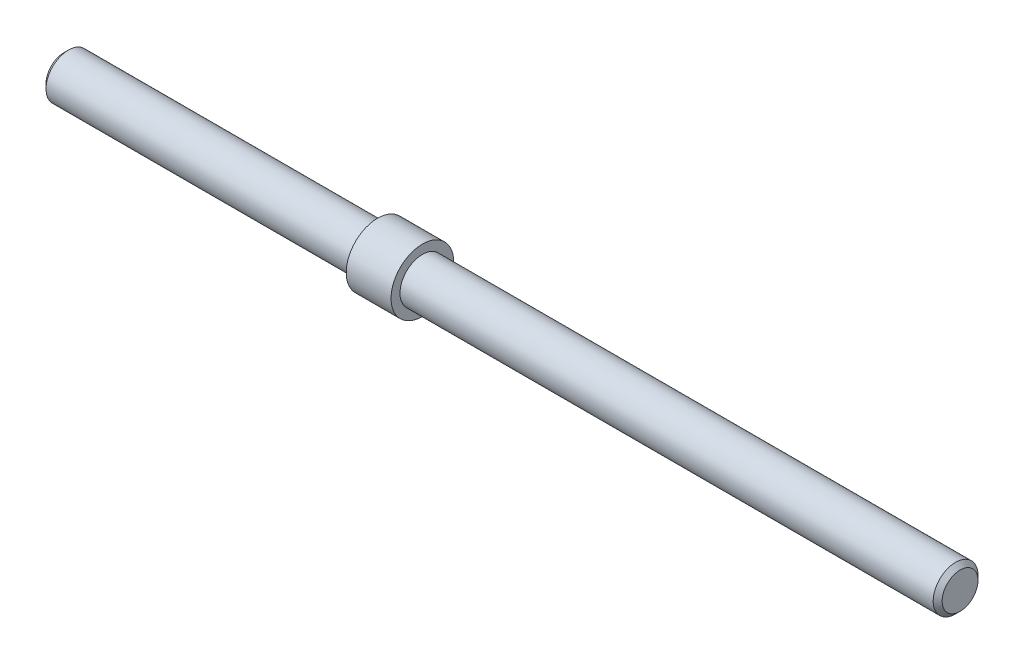
ISO-10303-21;
HEADER;
FILE_DESCRIPTION(('STEP AP214'),'2;1');
FILE_NAME('part.step','',(''),(''),'','','');
FILE_SCHEMA(('AUTOMOTIVE_DESIGN { 1 0 10303 214 1 1 1 1 }'));
ENDSEC;
DATA;
#1=APPLICATION_CONTEXT('core data for automotive mechanical design processes');
#2=APPLICATION_PROTOCOL_DEFINITION('international standard','automotive_design',2000,#1);
#3=PRODUCT_CONTEXT('',#1,'mechanical');
#4=PRODUCT('Part','Part','',(#3));
#5=PRODUCT_RELATED_PRODUCT_CATEGORY('part','',(#4));
#6=PRODUCT_DEFINITION_FORMATION('','',#4);
#7=PRODUCT_DEFINITION_CONTEXT('part definition',#1,'design');
#8=PRODUCT_DEFINITION('design','',#6,#7);
#9=PRODUCT_DEFINITION_SHAPE('','',#8);
#10=(LENGTH_UNIT() NAMED_UNIT(*) SI_UNIT(.MILLI.,.METRE.));
#11=(NAMED_UNIT(*) PLANE_ANGLE_UNIT() SI_UNIT($,.RADIAN.));
#12=(NAMED_UNIT(*) SI_UNIT($,.STERADIAN.) SOLID_ANGLE_UNIT());
#13=UNCERTAINTY_MEASURE_WITH_UNIT(LENGTH_MEASURE(1.E-05),#10,'distance_accuracy_value','');
#14=(GEOMETRIC_REPRESENTATION_CONTEXT(3) GLOBAL_UNCERTAINTY_ASSIGNED_CONTEXT((#13)) GLOBAL_UNIT_ASSIGNED_CONTEXT((#10,
#11,#12)) REPRESENTATION_CONTEXT('',''));
#15=CARTESIAN_POINT('',(0.,0.,0.));
#16=DIRECTION('',(0.,0.,1.));
#17=DIRECTION('',(1.,0.,0.));
#18=AXIS2_PLACEMENT_3D('',#15,#16,#17);
#19=CARTESIAN_POINT('',(200.,0.,0.));
#20=DIRECTION('',(-1.,0.,0.));
#21=DIRECTION('',(0.,0.,1.));
#22=AXIS2_PLACEMENT_3D('',#19,#20,#21);
#23=CYLINDRICAL_SURFACE('',#22,5.);
#24=CARTESIAN_POINT('',(80.,0.,0.));
#25=DIRECTION('',(1.,0.,0.));
#26=DIRECTION('',(0.,0.,-1.));
#27=AXIS2_PLACEMENT_3D('',#24,#25,#26);
#28=CIRCLE('',#27,5.);
#29=CARTESIAN_POINT('',(80.,0.,-5.));
#30=VERTEX_POINT('',#29);
#31=EDGE_CURVE('E48',#30,#30,#28,.T.);
#32=ORIENTED_EDGE('',*,*,#31,.T.);
#33=EDGE_LOOP('',(#32));
#34=FACE_BOUND('',#33,.T.);
#35=CARTESIAN_POINT('',(199.,0.,0.));
#36=DIRECTION('',(1.,0.,0.));
#37=DIRECTION('',(0.,0.,-1.));
#38=AXIS2_PLACEMENT_3D('',#35,#36,#37);
#39=CIRCLE('',#38,5.);
#40=CARTESIAN_POINT('',(199.,0.,-5.));
#41=VERTEX_POINT('',#40);
#42=EDGE_CURVE('E58',#41,#41,#39,.F.);
#43=ORIENTED_EDGE('',*,*,#42,.T.);
#44=EDGE_LOOP('',(#43));
#45=FACE_BOUND('',#44,.T.);
#46=ADVANCED_FACE('F43',(#34,#45),#23,.T.);
#47=CARTESIAN_POINT('',(200.,0.,0.));
#48=DIRECTION('',(1.,0.,0.));
#49=DIRECTION('',(0.,0.,-1.));
#50=AXIS2_PLACEMENT_3D('',#47,#48,#49);
#51=PLANE('',#50);
#52=CARTESIAN_POINT('',(200.,0.,0.));
#53=DIRECTION('',(1.,0.,0.));
#54=DIRECTION('',(0.,0.,-1.));
#55=AXIS2_PLACEMENT_3D('',#52,#53,#54);
#56=CIRCLE('',#55,4.);
#57=CARTESIAN_POINT('',(200.,0.,-4.));
#58=VERTEX_POINT('',#57);
#59=EDGE_CURVE('E68',#58,#58,#56,.T.);
#60=ORIENTED_EDGE('',*,*,#59,.T.);
#61=EDGE_LOOP('',(#60));
#62=FACE_BOUND('',#61,.T.);
#63=ADVANCED_FACE('F102',(#62),#51,.T.);
#64=CARTESIAN_POINT('',(200.,0.,0.));
#65=DIRECTION('',(-1.,0.,0.));
#66=DIRECTION('',(0.,0.,1.));
#67=AXIS2_PLACEMENT_3D('',#64,#65,#66);
#68=CONICAL_SURFACE('',#67,4.,0.78539816339746);
#69=ORIENTED_EDGE('',*,*,#42,.F.);
#70=EDGE_LOOP('',(#69));
#71=FACE_BOUND('',#70,.T.);
#72=ORIENTED_EDGE('',*,*,#59,.F.);
#73=EDGE_LOOP('',(#72));
#74=FACE_BOUND('',#73,.T.);
#75=ADVANCED_FACE('F98',(#71,#74),#68,.T.);
#76=CARTESIAN_POINT('',(80.,0.,0.));
#77=DIRECTION('',(-1.,0.,0.));
#78=DIRECTION('',(0.,0.,1.));
#79=AXIS2_PLACEMENT_3D('',#76,#77,#78);
#80=CYLINDRICAL_SURFACE('',#79,7.);
#81=CARTESIAN_POINT('',(80.,0.,0.));
#82=DIRECTION('',(1.,0.,0.));
#83=DIRECTION('',(0.,0.,-1.));
#84=AXIS2_PLACEMENT_3D('',#81,#82,#83);
#85=CIRCLE('',#84,7.);
#86=CARTESIAN_POINT('',(80.,0.,-7.));
#87=VERTEX_POINT('',#86);
#88=EDGE_CURVE('E76',#87,#87,#85,.T.);
#89=ORIENTED_EDGE('',*,*,#88,.F.);
#90=EDGE_LOOP('',(#89));
#91=FACE_BOUND('',#90,.T.);
#92=CARTESIAN_POINT('',(70.,0.,0.));
#93=DIRECTION('',(1.,0.,0.));
#94=DIRECTION('',(0.,0.,-1.));
#95=AXIS2_PLACEMENT_3D('',#92,#93,#94);
#96=CIRCLE('',#95,7.);
#97=CARTESIAN_POINT('',(70.,0.,-7.));
#98=VERTEX_POINT('',#97);
#99=EDGE_CURVE('E72',#98,#98,#96,.T.);
#100=ORIENTED_EDGE('',*,*,#99,.T.);
#101=EDGE_LOOP('',(#100));
#102=FACE_BOUND('',#101,.T.);
#103=ADVANCED_FACE('F90',(#91,#102),#80,.T.);
#104=CARTESIAN_POINT('',(80.,0.,0.));
#105=DIRECTION('',(1.,0.,0.));
#106=DIRECTION('',(0.,0.,-1.));
#107=AXIS2_PLACEMENT_3D('',#104,#105,#106);
#108=PLANE('',#107);
#109=ORIENTED_EDGE('',*,*,#31,.F.);
#110=EDGE_LOOP('',(#109));
#111=FACE_BOUND('',#110,.T.);
#112=ORIENTED_EDGE('',*,*,#88,.T.);
#113=EDGE_LOOP('',(#112));
#114=FACE_BOUND('',#113,.T.);
#115=ADVANCED_FACE('F87',(#111,#114),#108,.T.);
#116=CARTESIAN_POINT('',(70.,0.,0.));
#117=DIRECTION('',(1.,0.,0.));
#118=DIRECTION('',(0.,0.,-1.));
#119=AXIS2_PLACEMENT_3D('',#116,#117,#118);
#120=PLANE('',#119);
#121=CARTESIAN_POINT('',(70.,0.,0.));
#122=DIRECTION('',(1.,0.,0.));
#123=DIRECTION('',(0.,0.,-1.));
#124=AXIS2_PLACEMENT_3D('',#121,#122,#123);
#125=CIRCLE('',#124,5.);
#126=CARTESIAN_POINT('',(70.,0.,-5.));
#127=VERTEX_POINT('',#126);
#128=EDGE_CURVE('E10',#127,#127,#125,.T.);
#129=ORIENTED_EDGE('',*,*,#128,.T.);
#130=EDGE_LOOP('',(#129));
#131=FACE_BOUND('',#130,.T.);
#132=ORIENTED_EDGE('',*,*,#99,.F.);
#133=EDGE_LOOP('',(#132));
#134=FACE_BOUND('',#133,.T.);
#135=ADVANCED_FACE('F89',(#131,#134),#120,.F.);
#136=CARTESIAN_POINT('',(0.,0.,0.));
#137=DIRECTION('',(1.,0.,0.));
#138=DIRECTION('',(0.,0.,-1.));
#139=AXIS2_PLACEMENT_3D('',#136,#137,#138);
#140=PLANE('',#139);
#141=CARTESIAN_POINT('',(0.,0.,0.));
#142=DIRECTION('',(1.,0.,0.));
#143=DIRECTION('',(0.,0.,-1.));
#144=AXIS2_PLACEMENT_3D('',#141,#142,#143);
#145=CIRCLE('',#144,4.00000000000003);
#146=CARTESIAN_POINT('',(0.,0.,-4.00000000000003));
#147=VERTEX_POINT('',#146);
#148=EDGE_CURVE('E53',#147,#147,#145,.F.);
#149=ORIENTED_EDGE('',*,*,#148,.T.);
#150=EDGE_LOOP('',(#149));
#151=FACE_BOUND('',#150,.T.);
#152=ADVANCED_FACE('F96',(#151),#140,.F.);
#153=CARTESIAN_POINT('',(0.999999999999945,0.,0.));
#154=DIRECTION('',(1.,0.,0.));
#155=DIRECTION('',(0.,0.,-1.));
#156=AXIS2_PLACEMENT_3D('',#153,#154,#155);
#157=CONICAL_SURFACE('',#156,5.,0.78539816339746);
#158=ORIENTED_EDGE('',*,*,#148,.F.);
#159=EDGE_LOOP('',(#158));
#160=FACE_BOUND('',#159,.T.);
#161=CARTESIAN_POINT('',(0.999999999999945,0.,0.));
#162=DIRECTION('',(1.,0.,0.));
#163=DIRECTION('',(0.,0.,-1.));
#164=AXIS2_PLACEMENT_3D('',#161,#162,#163);
#165=CIRCLE('',#164,5.);
#166=CARTESIAN_POINT('',(0.999999999999945,0.,-5.));
#167=VERTEX_POINT('',#166);
#168=EDGE_CURVE('E64',#167,#167,#165,.T.);
#169=ORIENTED_EDGE('',*,*,#168,.F.);
#170=EDGE_LOOP('',(#169));
#171=FACE_BOUND('',#170,.T.);
#172=ADVANCED_FACE('F46',(#160,#171),#157,.T.);
#173=ORIENTED_EDGE('',*,*,#168,.T.);
#174=EDGE_LOOP('',(#173));
#175=FACE_BOUND('',#174,.T.);
#176=ORIENTED_EDGE('',*,*,#128,.F.);
#177=EDGE_LOOP('',(#176));
#178=FACE_BOUND('',#177,.T.);
#179=ADVANCED_FACE('F104',(#175,#178),#23,.T.);
#180=CLOSED_SHELL('',(#46,#63,#75,#103,#115,#135,#152,#172,#179));
#181=MANIFOLD_SOLID_BREP('B2',#180);
#182=ADVANCED_BREP_SHAPE_REPRESENTATION('',(#18,#181),#14);
#183=SHAPE_DEFINITION_REPRESENTATION(#9,#182);
ENDSEC;
END-ISO-10303-21;
